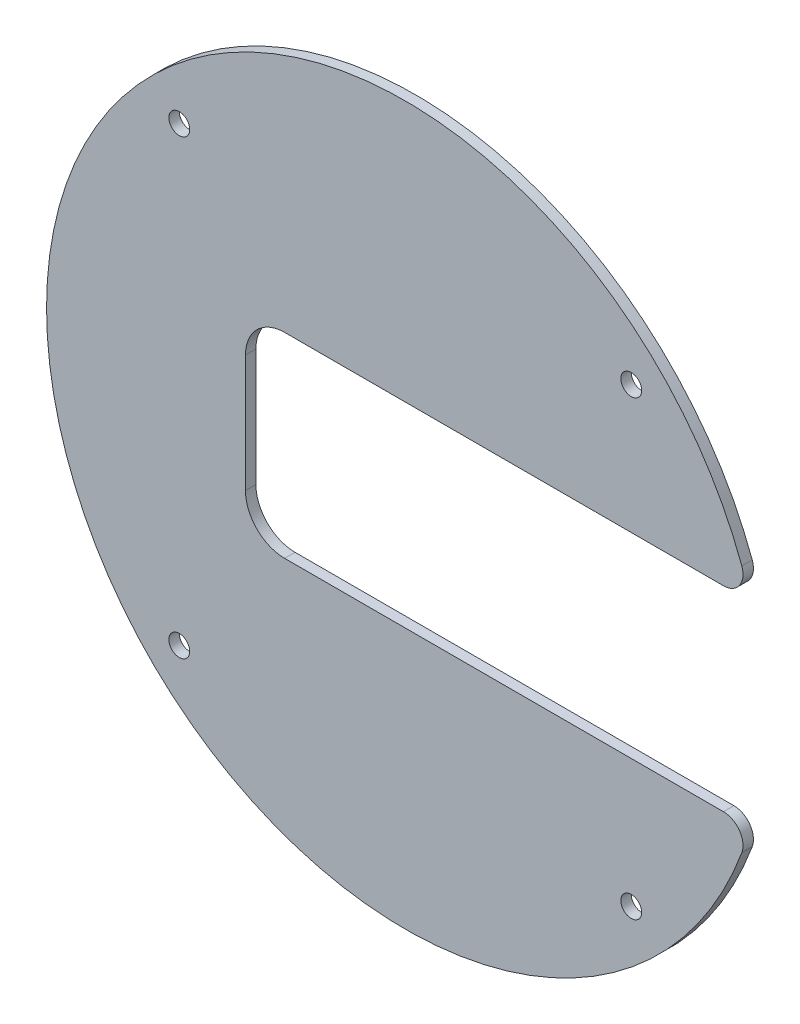
ISO-10303-21;
HEADER;
FILE_DESCRIPTION(('STEP AP214'),'2;1');
FILE_NAME('part.step','',(''),(''),'','','');
FILE_SCHEMA(('AUTOMOTIVE_DESIGN { 1 0 10303 214 1 1 1 1 }'));
ENDSEC;
DATA;
#1=APPLICATION_CONTEXT('core data for automotive mechanical design processes');
#2=APPLICATION_PROTOCOL_DEFINITION('international standard','automotive_design',2000,#1);
#3=PRODUCT_CONTEXT('',#1,'mechanical');
#4=PRODUCT('Part','Part','',(#3));
#5=PRODUCT_RELATED_PRODUCT_CATEGORY('part','',(#4));
#6=PRODUCT_DEFINITION_FORMATION('','',#4);
#7=PRODUCT_DEFINITION_CONTEXT('part definition',#1,'design');
#8=PRODUCT_DEFINITION('design','',#6,#7);
#9=PRODUCT_DEFINITION_SHAPE('','',#8);
#10=(LENGTH_UNIT() NAMED_UNIT(*) SI_UNIT(.MILLI.,.METRE.));
#11=(NAMED_UNIT(*) PLANE_ANGLE_UNIT() SI_UNIT($,.RADIAN.));
#12=(NAMED_UNIT(*) SI_UNIT($,.STERADIAN.) SOLID_ANGLE_UNIT());
#13=UNCERTAINTY_MEASURE_WITH_UNIT(LENGTH_MEASURE(1.E-05),#10,'distance_accuracy_value','');
#14=(GEOMETRIC_REPRESENTATION_CONTEXT(3) GLOBAL_UNCERTAINTY_ASSIGNED_CONTEXT((#13)) GLOBAL_UNIT_ASSIGNED_CONTEXT((#10,
#11,#12)) REPRESENTATION_CONTEXT('',''));
#15=CARTESIAN_POINT('',(0.,0.,0.));
#16=DIRECTION('',(0.,0.,1.));
#17=DIRECTION('',(1.,0.,0.));
#18=AXIS2_PLACEMENT_3D('',#15,#16,#17);
#19=CARTESIAN_POINT('',(0.,0.,1.6));
#20=DIRECTION('',(0.,0.,1.));
#21=DIRECTION('',(1.,0.,0.));
#22=AXIS2_PLACEMENT_3D('',#19,#20,#21);
#23=PLANE('',#22);
#24=CARTESIAN_POINT('',(-34.6482322781408,-34.6482322781408,1.6));
#25=DIRECTION('',(0.,0.,1.));
#26=DIRECTION('',(1.,0.,0.));
#27=AXIS2_PLACEMENT_3D('',#24,#25,#26);
#28=CIRCLE('',#27,1.6);
#29=CARTESIAN_POINT('',(-33.0482322781408,-34.6482322781408,1.6));
#30=VERTEX_POINT('',#29);
#31=EDGE_CURVE('E226',#30,#30,#28,.T.);
#32=ORIENTED_EDGE('',*,*,#31,.F.);
#33=EDGE_LOOP('',(#32));
#34=FACE_BOUND('',#33,.T.);
#35=CARTESIAN_POINT('',(34.6482322781408,34.6482322781408,1.6));
#36=DIRECTION('',(0.,0.,1.));
#37=DIRECTION('',(1.,0.,0.));
#38=AXIS2_PLACEMENT_3D('',#35,#36,#37);
#39=CIRCLE('',#38,1.6);
#40=CARTESIAN_POINT('',(36.2482322781408,34.6482322781408,1.6));
#41=VERTEX_POINT('',#40);
#42=EDGE_CURVE('E235',#41,#41,#39,.T.);
#43=ORIENTED_EDGE('',*,*,#42,.F.);
#44=EDGE_LOOP('',(#43));
#45=FACE_BOUND('',#44,.T.);
#46=DIRECTION('',(1.,0.,0.));
#47=VECTOR('',#46,1.);
#48=CARTESIAN_POINT('',(-24.5,15.,1.6));
#49=LINE('',#48,#47);
#50=CARTESIAN_POINT('',(-18.5,15.,1.6));
#51=VERTEX_POINT('',#50);
#52=CARTESIAN_POINT('',(48.7852436706019,15.,1.6));
#53=VERTEX_POINT('',#52);
#54=EDGE_CURVE('E116',#51,#53,#49,.T.);
#55=ORIENTED_EDGE('',*,*,#54,.T.);
#56=CARTESIAN_POINT('',(48.7852436706019,18.,1.6));
#57=DIRECTION('',(0.,0.,1.));
#58=DIRECTION('',(1.,0.,0.));
#59=AXIS2_PLACEMENT_3D('',#56,#57,#58);
#60=CIRCLE('',#59,3.);
#61=CARTESIAN_POINT('',(51.5997769592904,19.0384615384615,1.6));
#62=VERTEX_POINT('',#61);
#63=EDGE_CURVE('E41',#53,#62,#60,.T.);
#64=ORIENTED_EDGE('',*,*,#63,.T.);
#65=CARTESIAN_POINT('',(0.,0.,1.6));
#66=DIRECTION('',(0.,0.,1.));
#67=DIRECTION('',(1.,0.,0.));
#68=AXIS2_PLACEMENT_3D('',#65,#66,#67);
#69=CIRCLE('',#68,55.);
#70=CARTESIAN_POINT('',(51.5997769592904,-19.0384615384615,1.6));
#71=VERTEX_POINT('',#70);
#72=EDGE_CURVE('E123',#62,#71,#69,.T.);
#73=ORIENTED_EDGE('',*,*,#72,.T.);
#74=CARTESIAN_POINT('',(48.7852436706019,-18.,1.6));
#75=DIRECTION('',(0.,0.,1.));
#76=DIRECTION('',(1.,0.,0.));
#77=AXIS2_PLACEMENT_3D('',#74,#75,#76);
#78=CIRCLE('',#77,3.);
#79=CARTESIAN_POINT('',(48.7852436706019,-15.,1.6));
#80=VERTEX_POINT('',#79);
#81=EDGE_CURVE('E48',#71,#80,#78,.T.);
#82=ORIENTED_EDGE('',*,*,#81,.T.);
#83=DIRECTION('',(-1.,0.,0.));
#84=VECTOR('',#83,1.);
#85=CARTESIAN_POINT('',(52.9150262212918,-15.,1.6));
#86=LINE('',#85,#84);
#87=CARTESIAN_POINT('',(-18.5,-15.,1.6));
#88=VERTEX_POINT('',#87);
#89=EDGE_CURVE('E126',#80,#88,#86,.T.);
#90=ORIENTED_EDGE('',*,*,#89,.T.);
#91=CARTESIAN_POINT('',(-18.5,-9.,1.6));
#92=DIRECTION('',(0.,0.,1.));
#93=DIRECTION('',(1.,0.,0.));
#94=AXIS2_PLACEMENT_3D('',#91,#92,#93);
#95=CIRCLE('',#94,6.);
#96=CARTESIAN_POINT('',(-24.5,-9.,1.6));
#97=VERTEX_POINT('',#96);
#98=EDGE_CURVE('E141',#88,#97,#95,.F.);
#99=ORIENTED_EDGE('',*,*,#98,.T.);
#100=DIRECTION('',(0.,1.,0.));
#101=VECTOR('',#100,1.);
#102=CARTESIAN_POINT('',(-24.5,-15.,1.6));
#103=LINE('',#102,#101);
#104=CARTESIAN_POINT('',(-24.5,9.,1.6));
#105=VERTEX_POINT('',#104);
#106=EDGE_CURVE('E242',#97,#105,#103,.T.);
#107=ORIENTED_EDGE('',*,*,#106,.T.);
#108=CARTESIAN_POINT('',(-18.5,9.,1.6));
#109=DIRECTION('',(0.,0.,1.));
#110=DIRECTION('',(1.,0.,0.));
#111=AXIS2_PLACEMENT_3D('',#108,#109,#110);
#112=CIRCLE('',#111,6.);
#113=EDGE_CURVE('E111',#105,#51,#112,.F.);
#114=ORIENTED_EDGE('',*,*,#113,.T.);
#115=EDGE_LOOP('',(#55,#64,#73,#82,#90,#99,#107,#114));
#116=FACE_BOUND('',#115,.T.);
#117=CARTESIAN_POINT('',(-34.6482322781408,34.6482322781408,1.6));
#118=DIRECTION('',(0.,0.,1.));
#119=DIRECTION('',(1.,0.,0.));
#120=AXIS2_PLACEMENT_3D('',#117,#118,#119);
#121=CIRCLE('',#120,1.6);
#122=CARTESIAN_POINT('',(-33.0482322781408,34.6482322781408,1.6));
#123=VERTEX_POINT('',#122);
#124=EDGE_CURVE('E221',#123,#123,#121,.T.);
#125=ORIENTED_EDGE('',*,*,#124,.F.);
#126=EDGE_LOOP('',(#125));
#127=FACE_BOUND('',#126,.T.);
#128=CARTESIAN_POINT('',(34.6482322781408,-34.6482322781408,1.6));
#129=DIRECTION('',(0.,0.,1.));
#130=DIRECTION('',(1.,0.,0.));
#131=AXIS2_PLACEMENT_3D('',#128,#129,#130);
#132=CIRCLE('',#131,1.6);
#133=CARTESIAN_POINT('',(36.2482322781408,-34.6482322781408,1.6));
#134=VERTEX_POINT('',#133);
#135=EDGE_CURVE('E261',#134,#134,#132,.T.);
#136=ORIENTED_EDGE('',*,*,#135,.F.);
#137=EDGE_LOOP('',(#136));
#138=FACE_BOUND('',#137,.T.);
#139=ADVANCED_FACE('F33',(#34,#45,#116,#127,#138),#23,.T.);
#140=CARTESIAN_POINT('',(0.,0.,0.));
#141=DIRECTION('',(0.,0.,1.));
#142=DIRECTION('',(1.,0.,0.));
#143=AXIS2_PLACEMENT_3D('',#140,#141,#142);
#144=PLANE('',#143);
#145=CARTESIAN_POINT('',(0.,0.,0.));
#146=DIRECTION('',(0.,0.,1.));
#147=DIRECTION('',(1.,0.,0.));
#148=AXIS2_PLACEMENT_3D('',#145,#146,#147);
#149=CIRCLE('',#148,55.);
#150=CARTESIAN_POINT('',(51.5997769592904,19.0384615384615,0.));
#151=VERTEX_POINT('',#150);
#152=CARTESIAN_POINT('',(51.5997769592904,-19.0384615384615,0.));
#153=VERTEX_POINT('',#152);
#154=EDGE_CURVE('E238',#151,#153,#149,.T.);
#155=ORIENTED_EDGE('',*,*,#154,.F.);
#156=CARTESIAN_POINT('',(48.7852436706019,18.,0.));
#157=DIRECTION('',(0.,0.,1.));
#158=DIRECTION('',(1.,0.,0.));
#159=AXIS2_PLACEMENT_3D('',#156,#157,#158);
#160=CIRCLE('',#159,3.);
#161=CARTESIAN_POINT('',(48.7852436706019,15.,0.));
#162=VERTEX_POINT('',#161);
#163=EDGE_CURVE('E122',#151,#162,#160,.F.);
#164=ORIENTED_EDGE('',*,*,#163,.T.);
#165=DIRECTION('',(1.,0.,0.));
#166=VECTOR('',#165,1.);
#167=CARTESIAN_POINT('',(-24.5,15.,0.));
#168=LINE('',#167,#166);
#169=CARTESIAN_POINT('',(-18.5,15.,0.));
#170=VERTEX_POINT('',#169);
#171=EDGE_CURVE('E115',#170,#162,#168,.T.);
#172=ORIENTED_EDGE('',*,*,#171,.F.);
#173=CARTESIAN_POINT('',(-18.5,9.,0.));
#174=DIRECTION('',(0.,0.,1.));
#175=DIRECTION('',(1.,0.,0.));
#176=AXIS2_PLACEMENT_3D('',#173,#174,#175);
#177=CIRCLE('',#176,6.);
#178=CARTESIAN_POINT('',(-24.5,9.,0.));
#179=VERTEX_POINT('',#178);
#180=EDGE_CURVE('E101',#170,#179,#177,.T.);
#181=ORIENTED_EDGE('',*,*,#180,.T.);
#182=DIRECTION('',(0.,1.,0.));
#183=VECTOR('',#182,1.);
#184=CARTESIAN_POINT('',(-24.5,-15.,0.));
#185=LINE('',#184,#183);
#186=CARTESIAN_POINT('',(-24.5,-9.,0.));
#187=VERTEX_POINT('',#186);
#188=EDGE_CURVE('E124',#187,#179,#185,.T.);
#189=ORIENTED_EDGE('',*,*,#188,.F.);
#190=CARTESIAN_POINT('',(-18.5,-9.,0.));
#191=DIRECTION('',(0.,0.,1.));
#192=DIRECTION('',(1.,0.,0.));
#193=AXIS2_PLACEMENT_3D('',#190,#191,#192);
#194=CIRCLE('',#193,6.);
#195=CARTESIAN_POINT('',(-18.5,-15.,0.));
#196=VERTEX_POINT('',#195);
#197=EDGE_CURVE('E138',#187,#196,#194,.T.);
#198=ORIENTED_EDGE('',*,*,#197,.T.);
#199=DIRECTION('',(-1.,0.,0.));
#200=VECTOR('',#199,1.);
#201=CARTESIAN_POINT('',(52.9150262212918,-15.,0.));
#202=LINE('',#201,#200);
#203=CARTESIAN_POINT('',(48.7852436706019,-15.,0.));
#204=VERTEX_POINT('',#203);
#205=EDGE_CURVE('E128',#204,#196,#202,.T.);
#206=ORIENTED_EDGE('',*,*,#205,.F.);
#207=CARTESIAN_POINT('',(48.7852436706019,-18.,0.));
#208=DIRECTION('',(0.,0.,1.));
#209=DIRECTION('',(1.,0.,0.));
#210=AXIS2_PLACEMENT_3D('',#207,#208,#209);
#211=CIRCLE('',#210,3.);
#212=EDGE_CURVE('E148',#204,#153,#211,.F.);
#213=ORIENTED_EDGE('',*,*,#212,.T.);
#214=EDGE_LOOP('',(#155,#164,#172,#181,#189,#198,#206,#213));
#215=FACE_BOUND('',#214,.T.);
#216=CARTESIAN_POINT('',(34.6482322781408,34.6482322781408,0.));
#217=DIRECTION('',(0.,0.,1.));
#218=DIRECTION('',(1.,0.,0.));
#219=AXIS2_PLACEMENT_3D('',#216,#217,#218);
#220=CIRCLE('',#219,1.6);
#221=CARTESIAN_POINT('',(36.2482322781408,34.6482322781408,0.));
#222=VERTEX_POINT('',#221);
#223=EDGE_CURVE('E228',#222,#222,#220,.T.);
#224=ORIENTED_EDGE('',*,*,#223,.T.);
#225=EDGE_LOOP('',(#224));
#226=FACE_BOUND('',#225,.T.);
#227=CARTESIAN_POINT('',(-34.6482322781408,34.6482322781408,0.));
#228=DIRECTION('',(0.,0.,1.));
#229=DIRECTION('',(1.,0.,0.));
#230=AXIS2_PLACEMENT_3D('',#227,#228,#229);
#231=CIRCLE('',#230,1.6);
#232=CARTESIAN_POINT('',(-33.0482322781408,34.6482322781408,0.));
#233=VERTEX_POINT('',#232);
#234=EDGE_CURVE('E224',#233,#233,#231,.T.);
#235=ORIENTED_EDGE('',*,*,#234,.T.);
#236=EDGE_LOOP('',(#235));
#237=FACE_BOUND('',#236,.T.);
#238=CARTESIAN_POINT('',(-34.6482322781408,-34.6482322781408,0.));
#239=DIRECTION('',(0.,0.,1.));
#240=DIRECTION('',(1.,0.,0.));
#241=AXIS2_PLACEMENT_3D('',#238,#239,#240);
#242=CIRCLE('',#241,1.6);
#243=CARTESIAN_POINT('',(-33.0482322781408,-34.6482322781408,0.));
#244=VERTEX_POINT('',#243);
#245=EDGE_CURVE('E231',#244,#244,#242,.T.);
#246=ORIENTED_EDGE('',*,*,#245,.T.);
#247=EDGE_LOOP('',(#246));
#248=FACE_BOUND('',#247,.T.);
#249=CARTESIAN_POINT('',(34.6482322781408,-34.6482322781408,0.));
#250=DIRECTION('',(0.,0.,1.));
#251=DIRECTION('',(1.,0.,0.));
#252=AXIS2_PLACEMENT_3D('',#249,#250,#251);
#253=CIRCLE('',#252,1.6);
#254=CARTESIAN_POINT('',(36.2482322781408,-34.6482322781408,0.));
#255=VERTEX_POINT('',#254);
#256=EDGE_CURVE('E260',#255,#255,#253,.T.);
#257=ORIENTED_EDGE('',*,*,#256,.T.);
#258=EDGE_LOOP('',(#257));
#259=FACE_BOUND('',#258,.T.);
#260=ADVANCED_FACE('F120',(#215,#226,#237,#248,#259),#144,.F.);
#261=CARTESIAN_POINT('',(0.,0.,1.6));
#262=DIRECTION('',(0.,0.,-1.));
#263=DIRECTION('',(-1.,0.,0.));
#264=AXIS2_PLACEMENT_3D('',#261,#262,#263);
#265=CYLINDRICAL_SURFACE('',#264,55.);
#266=ORIENTED_EDGE('',*,*,#72,.F.);
#267=DIRECTION('',(0.,0.,-1.));
#268=VECTOR('',#267,1.);
#269=CARTESIAN_POINT('',(51.5997769592904,19.0384615384615,1.6));
#270=LINE('',#269,#268);
#271=EDGE_CURVE('E145',#62,#151,#270,.T.);
#272=ORIENTED_EDGE('',*,*,#271,.T.);
#273=ORIENTED_EDGE('',*,*,#154,.T.);
#274=DIRECTION('',(0.,0.,-1.));
#275=VECTOR('',#274,1.);
#276=CARTESIAN_POINT('',(51.5997769592904,-19.0384615384615,1.6));
#277=LINE('',#276,#275);
#278=EDGE_CURVE('E143',#153,#71,#277,.F.);
#279=ORIENTED_EDGE('',*,*,#278,.T.);
#280=EDGE_LOOP('',(#266,#272,#273,#279));
#281=FACE_BOUND('',#280,.T.);
#282=ADVANCED_FACE('F158',(#281),#265,.T.);
#283=CARTESIAN_POINT('',(52.9150262212918,-15.,1.6));
#284=DIRECTION('',(0.,-1.,0.));
#285=DIRECTION('',(0.,0.,-1.));
#286=AXIS2_PLACEMENT_3D('',#283,#284,#285);
#287=PLANE('',#286);
#288=ORIENTED_EDGE('',*,*,#89,.F.);
#289=DIRECTION('',(0.,0.,-1.));
#290=VECTOR('',#289,1.);
#291=CARTESIAN_POINT('',(48.7852436706019,-15.,1.6));
#292=LINE('',#291,#290);
#293=EDGE_CURVE('E11',#80,#204,#292,.T.);
#294=ORIENTED_EDGE('',*,*,#293,.T.);
#295=ORIENTED_EDGE('',*,*,#205,.T.);
#296=DIRECTION('',(0.,0.,-1.));
#297=VECTOR('',#296,1.);
#298=CARTESIAN_POINT('',(-18.5,-15.,1.6));
#299=LINE('',#298,#297);
#300=EDGE_CURVE('E112',#196,#88,#299,.F.);
#301=ORIENTED_EDGE('',*,*,#300,.T.);
#302=EDGE_LOOP('',(#288,#294,#295,#301));
#303=FACE_BOUND('',#302,.T.);
#304=ADVANCED_FACE('F189',(#303),#287,.F.);
#305=CARTESIAN_POINT('',(-24.5,-15.,1.6));
#306=DIRECTION('',(-1.,0.,0.));
#307=DIRECTION('',(0.,0.,1.));
#308=AXIS2_PLACEMENT_3D('',#305,#306,#307);
#309=PLANE('',#308);
#310=ORIENTED_EDGE('',*,*,#188,.T.);
#311=DIRECTION('',(0.,0.,-1.));
#312=VECTOR('',#311,1.);
#313=CARTESIAN_POINT('',(-24.5,9.,1.6));
#314=LINE('',#313,#312);
#315=EDGE_CURVE('E106',#179,#105,#314,.F.);
#316=ORIENTED_EDGE('',*,*,#315,.T.);
#317=ORIENTED_EDGE('',*,*,#106,.F.);
#318=DIRECTION('',(0.,0.,-1.));
#319=VECTOR('',#318,1.);
#320=CARTESIAN_POINT('',(-24.5,-9.,0.));
#321=LINE('',#320,#319);
#322=EDGE_CURVE('E117',#97,#187,#321,.T.);
#323=ORIENTED_EDGE('',*,*,#322,.T.);
#324=EDGE_LOOP('',(#310,#316,#317,#323));
#325=FACE_BOUND('',#324,.T.);
#326=ADVANCED_FACE('F186',(#325),#309,.F.);
#327=CARTESIAN_POINT('',(-24.5,15.,1.6));
#328=DIRECTION('',(0.,1.,0.));
#329=DIRECTION('',(0.,0.,1.));
#330=AXIS2_PLACEMENT_3D('',#327,#328,#329);
#331=PLANE('',#330);
#332=ORIENTED_EDGE('',*,*,#171,.T.);
#333=DIRECTION('',(0.,0.,-1.));
#334=VECTOR('',#333,1.);
#335=CARTESIAN_POINT('',(48.7852436706019,15.,1.6));
#336=LINE('',#335,#334);
#337=EDGE_CURVE('E56',#162,#53,#336,.F.);
#338=ORIENTED_EDGE('',*,*,#337,.T.);
#339=ORIENTED_EDGE('',*,*,#54,.F.);
#340=DIRECTION('',(0.,0.,-1.));
#341=VECTOR('',#340,1.);
#342=CARTESIAN_POINT('',(-18.5,15.,0.));
#343=LINE('',#342,#341);
#344=EDGE_CURVE('E105',#51,#170,#343,.T.);
#345=ORIENTED_EDGE('',*,*,#344,.T.);
#346=EDGE_LOOP('',(#332,#338,#339,#345));
#347=FACE_BOUND('',#346,.T.);
#348=ADVANCED_FACE('F114',(#347),#331,.F.);
#349=CARTESIAN_POINT('',(34.6482322781408,34.6482322781408,1.6));
#350=DIRECTION('',(0.,0.,-1.));
#351=DIRECTION('',(-1.,0.,0.));
#352=AXIS2_PLACEMENT_3D('',#349,#350,#351);
#353=CYLINDRICAL_SURFACE('',#352,1.6);
#354=ORIENTED_EDGE('',*,*,#42,.T.);
#355=EDGE_LOOP('',(#354));
#356=FACE_BOUND('',#355,.T.);
#357=ORIENTED_EDGE('',*,*,#223,.F.);
#358=EDGE_LOOP('',(#357));
#359=FACE_BOUND('',#358,.T.);
#360=ADVANCED_FACE('F181',(#356,#359),#353,.F.);
#361=CARTESIAN_POINT('',(-34.6482322781408,34.6482322781408,1.6));
#362=DIRECTION('',(0.,0.,-1.));
#363=DIRECTION('',(-1.,0.,0.));
#364=AXIS2_PLACEMENT_3D('',#361,#362,#363);
#365=CYLINDRICAL_SURFACE('',#364,1.6);
#366=ORIENTED_EDGE('',*,*,#124,.T.);
#367=EDGE_LOOP('',(#366));
#368=FACE_BOUND('',#367,.T.);
#369=ORIENTED_EDGE('',*,*,#234,.F.);
#370=EDGE_LOOP('',(#369));
#371=FACE_BOUND('',#370,.T.);
#372=ADVANCED_FACE('F207',(#368,#371),#365,.F.);
#373=CARTESIAN_POINT('',(-34.6482322781408,-34.6482322781408,1.6));
#374=DIRECTION('',(0.,0.,-1.));
#375=DIRECTION('',(-1.,0.,0.));
#376=AXIS2_PLACEMENT_3D('',#373,#374,#375);
#377=CYLINDRICAL_SURFACE('',#376,1.6);
#378=ORIENTED_EDGE('',*,*,#31,.T.);
#379=EDGE_LOOP('',(#378));
#380=FACE_BOUND('',#379,.T.);
#381=ORIENTED_EDGE('',*,*,#245,.F.);
#382=EDGE_LOOP('',(#381));
#383=FACE_BOUND('',#382,.T.);
#384=ADVANCED_FACE('F201',(#380,#383),#377,.F.);
#385=CARTESIAN_POINT('',(34.6482322781408,-34.6482322781408,1.6));
#386=DIRECTION('',(0.,0.,-1.));
#387=DIRECTION('',(-1.,0.,0.));
#388=AXIS2_PLACEMENT_3D('',#385,#386,#387);
#389=CYLINDRICAL_SURFACE('',#388,1.6);
#390=ORIENTED_EDGE('',*,*,#135,.T.);
#391=EDGE_LOOP('',(#390));
#392=FACE_BOUND('',#391,.T.);
#393=ORIENTED_EDGE('',*,*,#256,.F.);
#394=EDGE_LOOP('',(#393));
#395=FACE_BOUND('',#394,.T.);
#396=ADVANCED_FACE('F197',(#392,#395),#389,.F.);
#397=CARTESIAN_POINT('',(-18.5,9.,1.6));
#398=DIRECTION('',(0.,0.,1.));
#399=DIRECTION('',(1.,0.,0.));
#400=AXIS2_PLACEMENT_3D('',#397,#398,#399);
#401=CYLINDRICAL_SURFACE('',#400,6.);
#402=ORIENTED_EDGE('',*,*,#113,.F.);
#403=ORIENTED_EDGE('',*,*,#315,.F.);
#404=ORIENTED_EDGE('',*,*,#180,.F.);
#405=ORIENTED_EDGE('',*,*,#344,.F.);
#406=EDGE_LOOP('',(#402,#403,#404,#405));
#407=FACE_BOUND('',#406,.T.);
#408=ADVANCED_FACE('F104',(#407),#401,.F.);
#409=CARTESIAN_POINT('',(-18.5,-9.,1.6));
#410=DIRECTION('',(0.,0.,1.));
#411=DIRECTION('',(1.,0.,0.));
#412=AXIS2_PLACEMENT_3D('',#409,#410,#411);
#413=CYLINDRICAL_SURFACE('',#412,6.);
#414=ORIENTED_EDGE('',*,*,#98,.F.);
#415=ORIENTED_EDGE('',*,*,#300,.F.);
#416=ORIENTED_EDGE('',*,*,#197,.F.);
#417=ORIENTED_EDGE('',*,*,#322,.F.);
#418=EDGE_LOOP('',(#414,#415,#416,#417));
#419=FACE_BOUND('',#418,.T.);
#420=ADVANCED_FACE('F163',(#419),#413,.F.);
#421=CARTESIAN_POINT('',(48.7852436706019,18.,1.6));
#422=DIRECTION('',(0.,0.,-1.));
#423=DIRECTION('',(-1.,0.,0.));
#424=AXIS2_PLACEMENT_3D('',#421,#422,#423);
#425=CYLINDRICAL_SURFACE('',#424,3.);
#426=ORIENTED_EDGE('',*,*,#63,.F.);
#427=ORIENTED_EDGE('',*,*,#337,.F.);
#428=ORIENTED_EDGE('',*,*,#163,.F.);
#429=ORIENTED_EDGE('',*,*,#271,.F.);
#430=EDGE_LOOP('',(#426,#427,#428,#429));
#431=FACE_BOUND('',#430,.T.);
#432=ADVANCED_FACE('F161',(#431),#425,.T.);
#433=CARTESIAN_POINT('',(48.7852436706019,-18.,1.6));
#434=DIRECTION('',(0.,0.,-1.));
#435=DIRECTION('',(-1.,0.,0.));
#436=AXIS2_PLACEMENT_3D('',#433,#434,#435);
#437=CYLINDRICAL_SURFACE('',#436,3.);
#438=ORIENTED_EDGE('',*,*,#81,.F.);
#439=ORIENTED_EDGE('',*,*,#278,.F.);
#440=ORIENTED_EDGE('',*,*,#212,.F.);
#441=ORIENTED_EDGE('',*,*,#293,.F.);
#442=EDGE_LOOP('',(#438,#439,#440,#441));
#443=FACE_BOUND('',#442,.T.);
#444=ADVANCED_FACE('F35',(#443),#437,.T.);
#445=CLOSED_SHELL('',(#139,#260,#282,#304,#326,#348,#360,#372,#384,#396,#408,#420,#432,#444));
#446=MANIFOLD_SOLID_BREP('B2',#445);
#447=ADVANCED_BREP_SHAPE_REPRESENTATION('',(#18,#446),#14);
#448=SHAPE_DEFINITION_REPRESENTATION(#9,#447);
ENDSEC;
END-ISO-10303-21;
